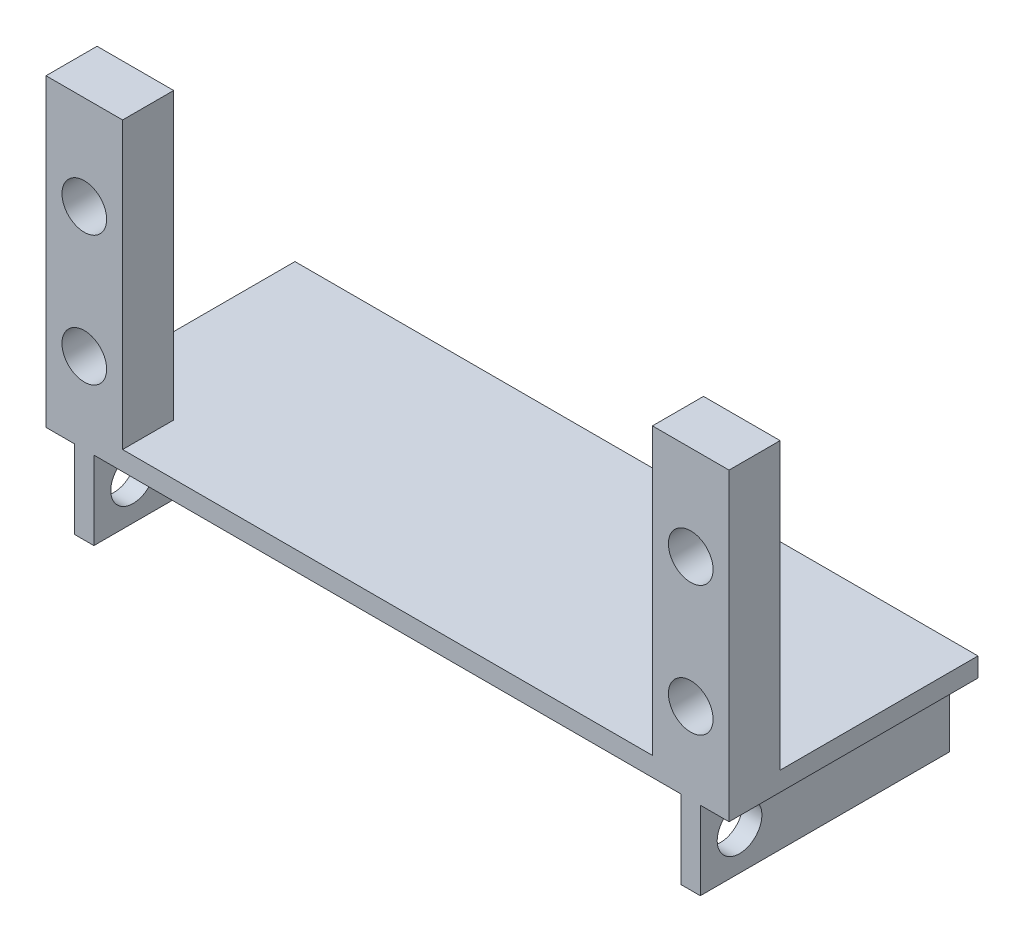
ISO-10303-21;
HEADER;
FILE_DESCRIPTION(('STEP AP214'),'2;1');
FILE_NAME('part.step','',(''),(''),'','','');
FILE_SCHEMA(('AUTOMOTIVE_DESIGN { 1 0 10303 214 1 1 1 1 }'));
ENDSEC;
DATA;
#1=APPLICATION_CONTEXT('core data for automotive mechanical design processes');
#2=APPLICATION_PROTOCOL_DEFINITION('international standard','automotive_design',2000,#1);
#3=PRODUCT_CONTEXT('',#1,'mechanical');
#4=PRODUCT('Part','Part','',(#3));
#5=PRODUCT_RELATED_PRODUCT_CATEGORY('part','',(#4));
#6=PRODUCT_DEFINITION_FORMATION('','',#4);
#7=PRODUCT_DEFINITION_CONTEXT('part definition',#1,'design');
#8=PRODUCT_DEFINITION('design','',#6,#7);
#9=PRODUCT_DEFINITION_SHAPE('','',#8);
#10=(LENGTH_UNIT() NAMED_UNIT(*) SI_UNIT(.MILLI.,.METRE.));
#11=(NAMED_UNIT(*) PLANE_ANGLE_UNIT() SI_UNIT($,.RADIAN.));
#12=(NAMED_UNIT(*) SI_UNIT($,.STERADIAN.) SOLID_ANGLE_UNIT());
#13=UNCERTAINTY_MEASURE_WITH_UNIT(LENGTH_MEASURE(1.E-05),#10,'distance_accuracy_value','');
#14=(GEOMETRIC_REPRESENTATION_CONTEXT(3) GLOBAL_UNCERTAINTY_ASSIGNED_CONTEXT((#13)) GLOBAL_UNIT_ASSIGNED_CONTEXT((#10,
#11,#12)) REPRESENTATION_CONTEXT('',''));
#15=CARTESIAN_POINT('',(0.,0.,0.));
#16=DIRECTION('',(0.,0.,1.));
#17=DIRECTION('',(1.,0.,0.));
#18=AXIS2_PLACEMENT_3D('',#15,#16,#17);
#19=CARTESIAN_POINT('',(0.,0.,0.));
#20=DIRECTION('',(0.,1.,0.));
#21=DIRECTION('',(0.,0.,1.));
#22=AXIS2_PLACEMENT_3D('',#19,#20,#21);
#23=PLANE('',#22);
#24=DIRECTION('',(-1.,0.,0.));
#25=VECTOR('',#24,1.);
#26=CARTESIAN_POINT('',(23.,0.,-8.25));
#27=LINE('',#26,#25);
#28=CARTESIAN_POINT('',(23.,0.,-8.25));
#29=VERTEX_POINT('',#28);
#30=CARTESIAN_POINT('',(-23.,0.,-8.25));
#31=VERTEX_POINT('',#30);
#32=EDGE_CURVE('E188',#29,#31,#27,.T.);
#33=ORIENTED_EDGE('',*,*,#32,.F.);
#34=DIRECTION('',(0.,0.,1.));
#35=VECTOR('',#34,1.);
#36=CARTESIAN_POINT('',(23.,0.,9.75));
#37=LINE('',#36,#35);
#38=CARTESIAN_POINT('',(23.,0.,9.75));
#39=VERTEX_POINT('',#38);
#40=EDGE_CURVE('E180',#29,#39,#37,.T.);
#41=ORIENTED_EDGE('',*,*,#40,.T.);
#42=DIRECTION('',(1.,0.,0.));
#43=VECTOR('',#42,1.);
#44=CARTESIAN_POINT('',(-26.75,0.,9.75));
#45=LINE('',#44,#43);
#46=CARTESIAN_POINT('',(-23.,0.,9.75));
#47=VERTEX_POINT('',#46);
#48=EDGE_CURVE('E346',#47,#39,#45,.T.);
#49=ORIENTED_EDGE('',*,*,#48,.F.);
#50=DIRECTION('',(0.,0.,1.));
#51=VECTOR('',#50,1.);
#52=CARTESIAN_POINT('',(-23.,0.,9.75));
#53=LINE('',#52,#51);
#54=EDGE_CURVE('E225',#31,#47,#53,.T.);
#55=ORIENTED_EDGE('',*,*,#54,.F.);
#56=EDGE_LOOP('',(#33,#41,#49,#55));
#57=FACE_BOUND('',#56,.T.);
#58=ADVANCED_FACE('F36',(#57),#23,.F.);
#59=CARTESIAN_POINT('',(-23.,-6.144,9.75));
#60=DIRECTION('',(-1.,0.,0.));
#61=DIRECTION('',(0.,0.,1.));
#62=AXIS2_PLACEMENT_3D('',#59,#60,#61);
#63=PLANE('',#62);
#64=CARTESIAN_POINT('',(-23.,-3.072,6.678));
#65=DIRECTION('',(-1.,0.,0.));
#66=DIRECTION('',(0.,0.,1.));
#67=AXIS2_PLACEMENT_3D('',#64,#65,#66);
#68=CIRCLE('',#67,1.75);
#69=CARTESIAN_POINT('',(-23.,-3.072,8.428));
#70=VERTEX_POINT('',#69);
#71=EDGE_CURVE('E706',#70,#70,#68,.T.);
#72=ORIENTED_EDGE('',*,*,#71,.T.);
#73=EDGE_LOOP('',(#72));
#74=FACE_BOUND('',#73,.T.);
#75=DIRECTION('',(0.,1.,0.));
#76=VECTOR('',#75,1.);
#77=CARTESIAN_POINT('',(-23.,-6.144,-8.25));
#78=LINE('',#77,#76);
#79=CARTESIAN_POINT('',(-23.,-6.144,-8.25));
#80=VERTEX_POINT('',#79);
#81=EDGE_CURVE('E53',#80,#31,#78,.T.);
#82=ORIENTED_EDGE('',*,*,#81,.T.);
#83=ORIENTED_EDGE('',*,*,#54,.T.);
#84=DIRECTION('',(0.,1.,0.));
#85=VECTOR('',#84,1.);
#86=CARTESIAN_POINT('',(-23.,-6.144,9.75));
#87=LINE('',#86,#85);
#88=CARTESIAN_POINT('',(-23.,-6.144,9.75));
#89=VERTEX_POINT('',#88);
#90=EDGE_CURVE('E242',#89,#47,#87,.T.);
#91=ORIENTED_EDGE('',*,*,#90,.F.);
#92=DIRECTION('',(0.,0.,1.));
#93=VECTOR('',#92,1.);
#94=CARTESIAN_POINT('',(-23.,-6.144,9.75));
#95=LINE('',#94,#93);
#96=EDGE_CURVE('E58',#80,#89,#95,.T.);
#97=ORIENTED_EDGE('',*,*,#96,.F.);
#98=EDGE_LOOP('',(#82,#83,#91,#97));
#99=FACE_BOUND('',#98,.T.);
#100=ADVANCED_FACE('F379',(#74,#99),#63,.F.);
#101=CARTESIAN_POINT('',(23.,-6.144,9.75));
#102=DIRECTION('',(-1.,0.,0.));
#103=DIRECTION('',(0.,0.,1.));
#104=AXIS2_PLACEMENT_3D('',#101,#102,#103);
#105=PLANE('',#104);
#106=CARTESIAN_POINT('',(23.,-3.072,6.67800000000001));
#107=DIRECTION('',(-1.,0.,0.));
#108=DIRECTION('',(0.,0.,1.));
#109=AXIS2_PLACEMENT_3D('',#106,#107,#108);
#110=CIRCLE('',#109,1.75);
#111=CARTESIAN_POINT('',(23.,-3.072,8.42800000000001));
#112=VERTEX_POINT('',#111);
#113=EDGE_CURVE('E704',#112,#112,#110,.T.);
#114=ORIENTED_EDGE('',*,*,#113,.F.);
#115=EDGE_LOOP('',(#114));
#116=FACE_BOUND('',#115,.T.);
#117=ORIENTED_EDGE('',*,*,#40,.F.);
#118=DIRECTION('',(0.,1.,0.));
#119=VECTOR('',#118,1.);
#120=CARTESIAN_POINT('',(23.,-6.144,-8.25));
#121=LINE('',#120,#119);
#122=CARTESIAN_POINT('',(23.,-6.144,-8.25));
#123=VERTEX_POINT('',#122);
#124=EDGE_CURVE('E178',#123,#29,#121,.T.);
#125=ORIENTED_EDGE('',*,*,#124,.F.);
#126=DIRECTION('',(0.,0.,1.));
#127=VECTOR('',#126,1.);
#128=CARTESIAN_POINT('',(23.,-6.144,9.75));
#129=LINE('',#128,#127);
#130=CARTESIAN_POINT('',(23.,-6.144,9.75));
#131=VERTEX_POINT('',#130);
#132=EDGE_CURVE('E161',#123,#131,#129,.T.);
#133=ORIENTED_EDGE('',*,*,#132,.T.);
#134=DIRECTION('',(0.,1.,0.));
#135=VECTOR('',#134,1.);
#136=CARTESIAN_POINT('',(23.,-6.144,9.75));
#137=LINE('',#136,#135);
#138=EDGE_CURVE('E213',#131,#39,#137,.T.);
#139=ORIENTED_EDGE('',*,*,#138,.T.);
#140=EDGE_LOOP('',(#117,#125,#133,#139));
#141=FACE_BOUND('',#140,.T.);
#142=ADVANCED_FACE('F179',(#116,#141),#105,.T.);
#143=CARTESIAN_POINT('',(24.5,0.,9.75));
#144=VERTEX_POINT('',#143);
#145=CARTESIAN_POINT('',(26.75,0.,9.75));
#146=VERTEX_POINT('',#145);
#147=EDGE_CURVE('E342',#144,#146,#45,.T.);
#148=ORIENTED_EDGE('',*,*,#147,.F.);
#149=DIRECTION('',(0.,0.,-1.));
#150=VECTOR('',#149,1.);
#151=CARTESIAN_POINT('',(24.5,0.,9.75));
#152=LINE('',#151,#150);
#153=CARTESIAN_POINT('',(24.5,0.,-9.75));
#154=VERTEX_POINT('',#153);
#155=EDGE_CURVE('E184',#144,#154,#152,.T.);
#156=ORIENTED_EDGE('',*,*,#155,.T.);
#157=DIRECTION('',(-1.,0.,0.));
#158=VECTOR('',#157,1.);
#159=CARTESIAN_POINT('',(-26.75,0.,-9.75));
#160=LINE('',#159,#158);
#161=CARTESIAN_POINT('',(26.75,0.,-9.75));
#162=VERTEX_POINT('',#161);
#163=EDGE_CURVE('E335',#162,#154,#160,.T.);
#164=ORIENTED_EDGE('',*,*,#163,.F.);
#165=DIRECTION('',(0.,0.,-1.));
#166=VECTOR('',#165,1.);
#167=CARTESIAN_POINT('',(26.75,0.,-9.75));
#168=LINE('',#167,#166);
#169=EDGE_CURVE('E316',#146,#162,#168,.T.);
#170=ORIENTED_EDGE('',*,*,#169,.F.);
#171=EDGE_LOOP('',(#148,#156,#164,#170));
#172=FACE_BOUND('',#171,.T.);
#173=ADVANCED_FACE('F391',(#172),#23,.F.);
#174=DIRECTION('',(0.,0.,-1.));
#175=VECTOR('',#174,1.);
#176=CARTESIAN_POINT('',(-24.5,0.,9.75));
#177=LINE('',#176,#175);
#178=CARTESIAN_POINT('',(-24.5,0.,9.75));
#179=VERTEX_POINT('',#178);
#180=CARTESIAN_POINT('',(-24.5,0.,-9.75));
#181=VERTEX_POINT('',#180);
#182=EDGE_CURVE('E220',#179,#181,#177,.T.);
#183=ORIENTED_EDGE('',*,*,#182,.F.);
#184=CARTESIAN_POINT('',(-26.75,0.,9.75));
#185=VERTEX_POINT('',#184);
#186=EDGE_CURVE('E321',#185,#179,#45,.T.);
#187=ORIENTED_EDGE('',*,*,#186,.F.);
#188=DIRECTION('',(0.,0.,1.));
#189=VECTOR('',#188,1.);
#190=CARTESIAN_POINT('',(-26.75,0.,-9.75));
#191=LINE('',#190,#189);
#192=CARTESIAN_POINT('',(-26.75,0.,-9.75));
#193=VERTEX_POINT('',#192);
#194=EDGE_CURVE('E339',#193,#185,#191,.T.);
#195=ORIENTED_EDGE('',*,*,#194,.F.);
#196=EDGE_CURVE('E334',#181,#193,#160,.T.);
#197=ORIENTED_EDGE('',*,*,#196,.F.);
#198=EDGE_LOOP('',(#183,#187,#195,#197));
#199=FACE_BOUND('',#198,.T.);
#200=ADVANCED_FACE('F366',(#199),#23,.F.);
#201=CARTESIAN_POINT('',(0.,1.5,0.));
#202=DIRECTION('',(0.,1.,0.));
#203=DIRECTION('',(0.,0.,1.));
#204=AXIS2_PLACEMENT_3D('',#201,#202,#203);
#205=PLANE('',#204);
#206=DIRECTION('',(0.,0.,1.));
#207=VECTOR('',#206,1.);
#208=CARTESIAN_POINT('',(20.75,1.5,9.74999999999999));
#209=LINE('',#208,#207);
#210=CARTESIAN_POINT('',(20.75,1.5,5.74999999999999));
#211=VERTEX_POINT('',#210);
#212=CARTESIAN_POINT('',(20.75,1.5,9.75));
#213=VERTEX_POINT('',#212);
#214=EDGE_CURVE('E256',#211,#213,#209,.T.);
#215=ORIENTED_EDGE('',*,*,#214,.F.);
#216=DIRECTION('',(-1.,0.,0.));
#217=VECTOR('',#216,1.);
#218=CARTESIAN_POINT('',(26.75,1.5,5.74999999999999));
#219=LINE('',#218,#217);
#220=CARTESIAN_POINT('',(26.75,1.5,5.74999999999999));
#221=VERTEX_POINT('',#220);
#222=EDGE_CURVE('E250',#221,#211,#219,.T.);
#223=ORIENTED_EDGE('',*,*,#222,.F.);
#224=DIRECTION('',(0.,0.,-1.));
#225=VECTOR('',#224,1.);
#226=CARTESIAN_POINT('',(26.75,1.5,-9.75));
#227=LINE('',#226,#225);
#228=CARTESIAN_POINT('',(26.75,1.5,-9.75));
#229=VERTEX_POINT('',#228);
#230=EDGE_CURVE('E317',#221,#229,#227,.T.);
#231=ORIENTED_EDGE('',*,*,#230,.T.);
#232=DIRECTION('',(-1.,0.,0.));
#233=VECTOR('',#232,1.);
#234=CARTESIAN_POINT('',(-26.75,1.5,-9.75));
#235=LINE('',#234,#233);
#236=CARTESIAN_POINT('',(-26.75,1.5,-9.75));
#237=VERTEX_POINT('',#236);
#238=EDGE_CURVE('E320',#229,#237,#235,.T.);
#239=ORIENTED_EDGE('',*,*,#238,.T.);
#240=DIRECTION('',(0.,0.,1.));
#241=VECTOR('',#240,1.);
#242=CARTESIAN_POINT('',(-26.75,1.5,-9.75));
#243=LINE('',#242,#241);
#244=CARTESIAN_POINT('',(-26.75,1.5,5.75));
#245=VERTEX_POINT('',#244);
#246=EDGE_CURVE('E324',#237,#245,#243,.T.);
#247=ORIENTED_EDGE('',*,*,#246,.T.);
#248=DIRECTION('',(-1.,0.,0.));
#249=VECTOR('',#248,1.);
#250=CARTESIAN_POINT('',(-26.75,1.5,5.75));
#251=LINE('',#250,#249);
#252=CARTESIAN_POINT('',(-20.75,1.5,5.75));
#253=VERTEX_POINT('',#252);
#254=EDGE_CURVE('E289',#253,#245,#251,.T.);
#255=ORIENTED_EDGE('',*,*,#254,.F.);
#256=DIRECTION('',(0.,0.,-1.));
#257=VECTOR('',#256,1.);
#258=CARTESIAN_POINT('',(-20.75,1.5,9.75));
#259=LINE('',#258,#257);
#260=CARTESIAN_POINT('',(-20.75,1.5,9.75));
#261=VERTEX_POINT('',#260);
#262=EDGE_CURVE('E283',#261,#253,#259,.T.);
#263=ORIENTED_EDGE('',*,*,#262,.F.);
#264=DIRECTION('',(1.,0.,0.));
#265=VECTOR('',#264,1.);
#266=CARTESIAN_POINT('',(-26.75,1.5,9.75));
#267=LINE('',#266,#265);
#268=EDGE_CURVE('E327',#261,#213,#267,.T.);
#269=ORIENTED_EDGE('',*,*,#268,.T.);
#270=EDGE_LOOP('',(#215,#223,#231,#239,#247,#255,#263,#269));
#271=FACE_BOUND('',#270,.T.);
#272=ADVANCED_FACE('F406',(#271),#205,.T.);
#273=CARTESIAN_POINT('',(26.75,1.5,-9.75));
#274=DIRECTION('',(-1.,0.,0.));
#275=DIRECTION('',(0.,0.,1.));
#276=AXIS2_PLACEMENT_3D('',#273,#274,#275);
#277=PLANE('',#276);
#278=ORIENTED_EDGE('',*,*,#169,.T.);
#279=DIRECTION('',(0.,-1.,0.));
#280=VECTOR('',#279,1.);
#281=CARTESIAN_POINT('',(26.75,1.5,-9.75));
#282=LINE('',#281,#280);
#283=EDGE_CURVE('E11',#229,#162,#282,.T.);
#284=ORIENTED_EDGE('',*,*,#283,.F.);
#285=ORIENTED_EDGE('',*,*,#230,.F.);
#286=DIRECTION('',(0.,-1.,0.));
#287=VECTOR('',#286,1.);
#288=CARTESIAN_POINT('',(26.75,23.856,5.74999999999999));
#289=LINE('',#288,#287);
#290=CARTESIAN_POINT('',(26.75,23.856,5.74999999999999));
#291=VERTEX_POINT('',#290);
#292=EDGE_CURVE('E279',#291,#221,#289,.T.);
#293=ORIENTED_EDGE('',*,*,#292,.F.);
#294=DIRECTION('',(0.,0.,-1.));
#295=VECTOR('',#294,1.);
#296=CARTESIAN_POINT('',(26.75,23.856,9.74999999999999));
#297=LINE('',#296,#295);
#298=CARTESIAN_POINT('',(26.75,23.856,9.74999999999999));
#299=VERTEX_POINT('',#298);
#300=EDGE_CURVE('E251',#299,#291,#297,.T.);
#301=ORIENTED_EDGE('',*,*,#300,.F.);
#302=DIRECTION('',(0.,-1.,0.));
#303=VECTOR('',#302,1.);
#304=CARTESIAN_POINT('',(26.75,1.5,9.75));
#305=LINE('',#304,#303);
#306=EDGE_CURVE('E330',#299,#146,#305,.T.);
#307=ORIENTED_EDGE('',*,*,#306,.T.);
#308=EDGE_LOOP('',(#278,#284,#285,#293,#301,#307));
#309=FACE_BOUND('',#308,.T.);
#310=ADVANCED_FACE('F38',(#309),#277,.F.);
#311=CARTESIAN_POINT('',(-26.75,1.5,-9.75));
#312=DIRECTION('',(0.,0.,1.));
#313=DIRECTION('',(1.,0.,0.));
#314=AXIS2_PLACEMENT_3D('',#311,#312,#313);
#315=PLANE('',#314);
#316=ORIENTED_EDGE('',*,*,#163,.T.);
#317=DIRECTION('',(0.,1.,0.));
#318=VECTOR('',#317,1.);
#319=CARTESIAN_POINT('',(24.5,-6.144,-9.75));
#320=LINE('',#319,#318);
#321=CARTESIAN_POINT('',(24.5,-6.144,-9.75));
#322=VERTEX_POINT('',#321);
#323=EDGE_CURVE('E174',#322,#154,#320,.T.);
#324=ORIENTED_EDGE('',*,*,#323,.F.);
#325=DIRECTION('',(1.,0.,0.));
#326=VECTOR('',#325,1.);
#327=CARTESIAN_POINT('',(-24.5,-6.144,-9.75));
#328=LINE('',#327,#326);
#329=CARTESIAN_POINT('',(-24.5,-6.144,-9.75));
#330=VERTEX_POINT('',#329);
#331=EDGE_CURVE('E224',#330,#322,#328,.T.);
#332=ORIENTED_EDGE('',*,*,#331,.F.);
#333=DIRECTION('',(0.,1.,0.));
#334=VECTOR('',#333,1.);
#335=CARTESIAN_POINT('',(-24.5,-6.144,-9.75));
#336=LINE('',#335,#334);
#337=EDGE_CURVE('E246',#330,#181,#336,.T.);
#338=ORIENTED_EDGE('',*,*,#337,.T.);
#339=ORIENTED_EDGE('',*,*,#196,.T.);
#340=DIRECTION('',(0.,-1.,0.));
#341=VECTOR('',#340,1.);
#342=CARTESIAN_POINT('',(-26.75,1.5,-9.75));
#343=LINE('',#342,#341);
#344=EDGE_CURVE('E46',#237,#193,#343,.T.);
#345=ORIENTED_EDGE('',*,*,#344,.F.);
#346=ORIENTED_EDGE('',*,*,#238,.F.);
#347=ORIENTED_EDGE('',*,*,#283,.T.);
#348=EDGE_LOOP('',(#316,#324,#332,#338,#339,#345,#346,#347));
#349=FACE_BOUND('',#348,.T.);
#350=ADVANCED_FACE('F392',(#349),#315,.F.);
#351=CARTESIAN_POINT('',(-26.75,1.5,-9.75));
#352=DIRECTION('',(1.,0.,0.));
#353=DIRECTION('',(0.,0.,-1.));
#354=AXIS2_PLACEMENT_3D('',#351,#352,#353);
#355=PLANE('',#354);
#356=ORIENTED_EDGE('',*,*,#194,.T.);
#357=DIRECTION('',(0.,-1.,0.));
#358=VECTOR('',#357,1.);
#359=CARTESIAN_POINT('',(-26.75,1.5,9.75));
#360=LINE('',#359,#358);
#361=CARTESIAN_POINT('',(-26.75,23.856,9.75));
#362=VERTEX_POINT('',#361);
#363=EDGE_CURVE('E350',#362,#185,#360,.T.);
#364=ORIENTED_EDGE('',*,*,#363,.F.);
#365=DIRECTION('',(0.,0.,1.));
#366=VECTOR('',#365,1.);
#367=CARTESIAN_POINT('',(-26.75,23.856,9.75));
#368=LINE('',#367,#366);
#369=CARTESIAN_POINT('',(-26.75,23.856,5.75));
#370=VERTEX_POINT('',#369);
#371=EDGE_CURVE('E284',#370,#362,#368,.T.);
#372=ORIENTED_EDGE('',*,*,#371,.F.);
#373=DIRECTION('',(0.,-1.,0.));
#374=VECTOR('',#373,1.);
#375=CARTESIAN_POINT('',(-26.75,23.856,5.75));
#376=LINE('',#375,#374);
#377=EDGE_CURVE('E298',#370,#245,#376,.T.);
#378=ORIENTED_EDGE('',*,*,#377,.T.);
#379=ORIENTED_EDGE('',*,*,#246,.F.);
#380=ORIENTED_EDGE('',*,*,#344,.T.);
#381=EDGE_LOOP('',(#356,#364,#372,#378,#379,#380));
#382=FACE_BOUND('',#381,.T.);
#383=ADVANCED_FACE('F361',(#382),#355,.F.);
#384=CARTESIAN_POINT('',(-26.75,1.5,9.75));
#385=DIRECTION('',(0.,0.,-1.));
#386=DIRECTION('',(-1.,0.,0.));
#387=AXIS2_PLACEMENT_3D('',#384,#385,#386);
#388=PLANE('',#387);
#389=CARTESIAN_POINT('',(23.75,6.326,9.75));
#390=DIRECTION('',(0.,0.,-1.));
#391=DIRECTION('',(-1.,0.,0.));
#392=AXIS2_PLACEMENT_3D('',#389,#390,#391);
#393=CIRCLE('',#392,1.75);
#394=CARTESIAN_POINT('',(22.,6.326,9.75));
#395=VERTEX_POINT('',#394);
#396=EDGE_CURVE('E718',#395,#395,#393,.T.);
#397=ORIENTED_EDGE('',*,*,#396,.T.);
#398=EDGE_LOOP('',(#397));
#399=FACE_BOUND('',#398,.T.);
#400=CARTESIAN_POINT('',(23.75,16.486,9.75));
#401=DIRECTION('',(0.,0.,-1.));
#402=DIRECTION('',(-1.,0.,0.));
#403=AXIS2_PLACEMENT_3D('',#400,#401,#402);
#404=CIRCLE('',#403,1.75);
#405=CARTESIAN_POINT('',(22.,16.486,9.75));
#406=VERTEX_POINT('',#405);
#407=EDGE_CURVE('E725',#406,#406,#404,.T.);
#408=ORIENTED_EDGE('',*,*,#407,.T.);
#409=EDGE_LOOP('',(#408));
#410=FACE_BOUND('',#409,.T.);
#411=CARTESIAN_POINT('',(-23.75,6.326,9.75));
#412=DIRECTION('',(0.,0.,1.));
#413=DIRECTION('',(1.,0.,0.));
#414=AXIS2_PLACEMENT_3D('',#411,#412,#413);
#415=CIRCLE('',#414,1.75);
#416=CARTESIAN_POINT('',(-22.,6.326,9.75));
#417=VERTEX_POINT('',#416);
#418=EDGE_CURVE('E732',#417,#417,#415,.T.);
#419=ORIENTED_EDGE('',*,*,#418,.F.);
#420=EDGE_LOOP('',(#419));
#421=FACE_BOUND('',#420,.T.);
#422=CARTESIAN_POINT('',(-23.75,16.486,9.75));
#423=DIRECTION('',(0.,0.,1.));
#424=DIRECTION('',(1.,0.,0.));
#425=AXIS2_PLACEMENT_3D('',#422,#423,#424);
#426=CIRCLE('',#425,1.75);
#427=CARTESIAN_POINT('',(-22.,16.486,9.75));
#428=VERTEX_POINT('',#427);
#429=EDGE_CURVE('E721',#428,#428,#426,.T.);
#430=ORIENTED_EDGE('',*,*,#429,.F.);
#431=EDGE_LOOP('',(#430));
#432=FACE_BOUND('',#431,.T.);
#433=ORIENTED_EDGE('',*,*,#186,.T.);
#434=DIRECTION('',(0.,1.,0.));
#435=VECTOR('',#434,1.);
#436=CARTESIAN_POINT('',(-24.5,-6.144,9.75));
#437=LINE('',#436,#435);
#438=CARTESIAN_POINT('',(-24.5,-6.144,9.75));
#439=VERTEX_POINT('',#438);
#440=EDGE_CURVE('E233',#439,#179,#437,.T.);
#441=ORIENTED_EDGE('',*,*,#440,.F.);
#442=DIRECTION('',(-1.,0.,0.));
#443=VECTOR('',#442,1.);
#444=CARTESIAN_POINT('',(-24.5,-6.144,9.75));
#445=LINE('',#444,#443);
#446=EDGE_CURVE('E230',#89,#439,#445,.T.);
#447=ORIENTED_EDGE('',*,*,#446,.F.);
#448=ORIENTED_EDGE('',*,*,#90,.T.);
#449=ORIENTED_EDGE('',*,*,#48,.T.);
#450=ORIENTED_EDGE('',*,*,#138,.F.);
#451=DIRECTION('',(1.,0.,0.));
#452=VECTOR('',#451,1.);
#453=CARTESIAN_POINT('',(24.5,-6.144,9.75));
#454=LINE('',#453,#452);
#455=CARTESIAN_POINT('',(24.5,-6.144,9.75));
#456=VERTEX_POINT('',#455);
#457=EDGE_CURVE('E169',#131,#456,#454,.T.);
#458=ORIENTED_EDGE('',*,*,#457,.T.);
#459=DIRECTION('',(0.,1.,0.));
#460=VECTOR('',#459,1.);
#461=CARTESIAN_POINT('',(24.5,-6.144,9.75));
#462=LINE('',#461,#460);
#463=EDGE_CURVE('E216',#456,#144,#462,.T.);
#464=ORIENTED_EDGE('',*,*,#463,.T.);
#465=ORIENTED_EDGE('',*,*,#147,.T.);
#466=ORIENTED_EDGE('',*,*,#306,.F.);
#467=DIRECTION('',(1.,0.,0.));
#468=VECTOR('',#467,1.);
#469=CARTESIAN_POINT('',(26.75,23.856,9.74999999999999));
#470=LINE('',#469,#468);
#471=CARTESIAN_POINT('',(20.75,23.856,9.74999999999999));
#472=VERTEX_POINT('',#471);
#473=EDGE_CURVE('E262',#472,#299,#470,.T.);
#474=ORIENTED_EDGE('',*,*,#473,.F.);
#475=DIRECTION('',(0.,-1.,0.));
#476=VECTOR('',#475,1.);
#477=CARTESIAN_POINT('',(20.75,23.856,9.74999999999999));
#478=LINE('',#477,#476);
#479=EDGE_CURVE('E266',#472,#213,#478,.T.);
#480=ORIENTED_EDGE('',*,*,#479,.T.);
#481=ORIENTED_EDGE('',*,*,#268,.F.);
#482=DIRECTION('',(0.,-1.,0.));
#483=VECTOR('',#482,1.);
#484=CARTESIAN_POINT('',(-20.75,23.856,9.75));
#485=LINE('',#484,#483);
#486=CARTESIAN_POINT('',(-20.75,23.856,9.75));
#487=VERTEX_POINT('',#486);
#488=EDGE_CURVE('E312',#487,#261,#485,.T.);
#489=ORIENTED_EDGE('',*,*,#488,.F.);
#490=DIRECTION('',(1.,0.,0.));
#491=VECTOR('',#490,1.);
#492=CARTESIAN_POINT('',(-26.75,23.856,9.75));
#493=LINE('',#492,#491);
#494=EDGE_CURVE('E288',#362,#487,#493,.T.);
#495=ORIENTED_EDGE('',*,*,#494,.F.);
#496=ORIENTED_EDGE('',*,*,#363,.T.);
#497=EDGE_LOOP('',(#433,#441,#447,#448,#449,#450,#458,#464,#465,#466,#474,#480,#481,#489,#495,#496));
#498=FACE_BOUND('',#497,.T.);
#499=ADVANCED_FACE('F369',(#399,#410,#421,#432,#498),#388,.F.);
#500=CARTESIAN_POINT('',(-20.75,23.856,9.75));
#501=DIRECTION('',(-1.,0.,0.));
#502=DIRECTION('',(0.,0.,1.));
#503=AXIS2_PLACEMENT_3D('',#500,#501,#502);
#504=PLANE('',#503);
#505=ORIENTED_EDGE('',*,*,#262,.T.);
#506=DIRECTION('',(0.,-1.,0.));
#507=VECTOR('',#506,1.);
#508=CARTESIAN_POINT('',(-20.75,23.856,5.75));
#509=LINE('',#508,#507);
#510=CARTESIAN_POINT('',(-20.75,23.856,5.75));
#511=VERTEX_POINT('',#510);
#512=EDGE_CURVE('E308',#511,#253,#509,.T.);
#513=ORIENTED_EDGE('',*,*,#512,.F.);
#514=DIRECTION('',(0.,0.,-1.));
#515=VECTOR('',#514,1.);
#516=CARTESIAN_POINT('',(-20.75,23.856,9.75));
#517=LINE('',#516,#515);
#518=EDGE_CURVE('E292',#487,#511,#517,.T.);
#519=ORIENTED_EDGE('',*,*,#518,.F.);
#520=ORIENTED_EDGE('',*,*,#488,.T.);
#521=EDGE_LOOP('',(#505,#513,#519,#520));
#522=FACE_BOUND('',#521,.T.);
#523=ADVANCED_FACE('F409',(#522),#504,.F.);
#524=CARTESIAN_POINT('',(-26.75,23.856,5.75));
#525=DIRECTION('',(0.,0.,1.));
#526=DIRECTION('',(1.,0.,0.));
#527=AXIS2_PLACEMENT_3D('',#524,#525,#526);
#528=PLANE('',#527);
#529=CARTESIAN_POINT('',(-23.75,6.326,5.75));
#530=DIRECTION('',(0.,0.,1.));
#531=DIRECTION('',(1.,0.,0.));
#532=AXIS2_PLACEMENT_3D('',#529,#530,#531);
#533=CIRCLE('',#532,1.75);
#534=CARTESIAN_POINT('',(-22.,6.326,5.75));
#535=VERTEX_POINT('',#534);
#536=EDGE_CURVE('E194',#535,#535,#533,.F.);
#537=ORIENTED_EDGE('',*,*,#536,.F.);
#538=EDGE_LOOP('',(#537));
#539=FACE_BOUND('',#538,.T.);
#540=CARTESIAN_POINT('',(-23.75,16.486,5.75));
#541=DIRECTION('',(0.,0.,1.));
#542=DIRECTION('',(1.,0.,0.));
#543=AXIS2_PLACEMENT_3D('',#540,#541,#542);
#544=CIRCLE('',#543,1.75);
#545=CARTESIAN_POINT('',(-22.,16.486,5.75));
#546=VERTEX_POINT('',#545);
#547=EDGE_CURVE('E197',#546,#546,#544,.F.);
#548=ORIENTED_EDGE('',*,*,#547,.F.);
#549=EDGE_LOOP('',(#548));
#550=FACE_BOUND('',#549,.T.);
#551=ORIENTED_EDGE('',*,*,#254,.T.);
#552=ORIENTED_EDGE('',*,*,#377,.F.);
#553=DIRECTION('',(-1.,0.,0.));
#554=VECTOR('',#553,1.);
#555=CARTESIAN_POINT('',(-26.75,23.856,5.75));
#556=LINE('',#555,#554);
#557=EDGE_CURVE('E295',#511,#370,#556,.T.);
#558=ORIENTED_EDGE('',*,*,#557,.F.);
#559=ORIENTED_EDGE('',*,*,#512,.T.);
#560=EDGE_LOOP('',(#551,#552,#558,#559));
#561=FACE_BOUND('',#560,.T.);
#562=ADVANCED_FACE('F413',(#539,#550,#561),#528,.F.);
#563=CARTESIAN_POINT('',(0.,23.856,0.));
#564=DIRECTION('',(0.,-1.,0.));
#565=DIRECTION('',(0.,0.,-1.));
#566=AXIS2_PLACEMENT_3D('',#563,#564,#565);
#567=PLANE('',#566);
#568=ORIENTED_EDGE('',*,*,#371,.T.);
#569=ORIENTED_EDGE('',*,*,#494,.T.);
#570=ORIENTED_EDGE('',*,*,#518,.T.);
#571=ORIENTED_EDGE('',*,*,#557,.T.);
#572=EDGE_LOOP('',(#568,#569,#570,#571));
#573=FACE_BOUND('',#572,.T.);
#574=ADVANCED_FACE('F417',(#573),#567,.F.);
#575=CARTESIAN_POINT('',(26.75,23.856,5.74999999999999));
#576=DIRECTION('',(0.,0.,1.));
#577=DIRECTION('',(1.,0.,0.));
#578=AXIS2_PLACEMENT_3D('',#575,#576,#577);
#579=PLANE('',#578);
#580=CARTESIAN_POINT('',(23.75,6.326,5.74999999999999));
#581=DIRECTION('',(0.,0.,1.));
#582=DIRECTION('',(1.,0.,0.));
#583=AXIS2_PLACEMENT_3D('',#580,#581,#582);
#584=CIRCLE('',#583,1.75);
#585=CARTESIAN_POINT('',(25.5,6.326,5.74999999999999));
#586=VERTEX_POINT('',#585);
#587=EDGE_CURVE('E722',#586,#586,#584,.T.);
#588=ORIENTED_EDGE('',*,*,#587,.T.);
#589=EDGE_LOOP('',(#588));
#590=FACE_BOUND('',#589,.T.);
#591=CARTESIAN_POINT('',(23.75,16.486,5.74999999999999));
#592=DIRECTION('',(0.,0.,1.));
#593=DIRECTION('',(1.,0.,0.));
#594=AXIS2_PLACEMENT_3D('',#591,#592,#593);
#595=CIRCLE('',#594,1.75);
#596=CARTESIAN_POINT('',(25.5,16.486,5.74999999999999));
#597=VERTEX_POINT('',#596);
#598=EDGE_CURVE('E711',#597,#597,#595,.T.);
#599=ORIENTED_EDGE('',*,*,#598,.T.);
#600=EDGE_LOOP('',(#599));
#601=FACE_BOUND('',#600,.T.);
#602=ORIENTED_EDGE('',*,*,#222,.T.);
#603=DIRECTION('',(0.,-1.,0.));
#604=VECTOR('',#603,1.);
#605=CARTESIAN_POINT('',(20.75,23.856,5.74999999999999));
#606=LINE('',#605,#604);
#607=CARTESIAN_POINT('',(20.75,23.856,5.74999999999999));
#608=VERTEX_POINT('',#607);
#609=EDGE_CURVE('E275',#608,#211,#606,.T.);
#610=ORIENTED_EDGE('',*,*,#609,.F.);
#611=DIRECTION('',(-1.,0.,0.));
#612=VECTOR('',#611,1.);
#613=CARTESIAN_POINT('',(26.75,23.856,5.74999999999999));
#614=LINE('',#613,#612);
#615=EDGE_CURVE('E255',#291,#608,#614,.T.);
#616=ORIENTED_EDGE('',*,*,#615,.F.);
#617=ORIENTED_EDGE('',*,*,#292,.T.);
#618=EDGE_LOOP('',(#602,#610,#616,#617));
#619=FACE_BOUND('',#618,.T.);
#620=ADVANCED_FACE('F396',(#590,#601,#619),#579,.F.);
#621=CARTESIAN_POINT('',(20.75,23.856,9.74999999999999));
#622=DIRECTION('',(1.,0.,0.));
#623=DIRECTION('',(0.,0.,-1.));
#624=AXIS2_PLACEMENT_3D('',#621,#622,#623);
#625=PLANE('',#624);
#626=ORIENTED_EDGE('',*,*,#214,.T.);
#627=ORIENTED_EDGE('',*,*,#479,.F.);
#628=DIRECTION('',(0.,0.,1.));
#629=VECTOR('',#628,1.);
#630=CARTESIAN_POINT('',(20.75,23.856,9.74999999999999));
#631=LINE('',#630,#629);
#632=EDGE_CURVE('E259',#608,#472,#631,.T.);
#633=ORIENTED_EDGE('',*,*,#632,.F.);
#634=ORIENTED_EDGE('',*,*,#609,.T.);
#635=EDGE_LOOP('',(#626,#627,#633,#634));
#636=FACE_BOUND('',#635,.T.);
#637=ADVANCED_FACE('F405',(#636),#625,.F.);
#638=CARTESIAN_POINT('',(0.,23.856,0.));
#639=DIRECTION('',(0.,1.,0.));
#640=DIRECTION('',(0.,0.,1.));
#641=AXIS2_PLACEMENT_3D('',#638,#639,#640);
#642=PLANE('',#641);
#643=ORIENTED_EDGE('',*,*,#300,.T.);
#644=ORIENTED_EDGE('',*,*,#615,.T.);
#645=ORIENTED_EDGE('',*,*,#632,.T.);
#646=ORIENTED_EDGE('',*,*,#473,.T.);
#647=EDGE_LOOP('',(#643,#644,#645,#646));
#648=FACE_BOUND('',#647,.T.);
#649=ADVANCED_FACE('F400',(#648),#642,.T.);
#650=CARTESIAN_POINT('',(-24.5,-6.144,9.75));
#651=DIRECTION('',(1.,0.,0.));
#652=DIRECTION('',(0.,0.,-1.));
#653=AXIS2_PLACEMENT_3D('',#650,#651,#652);
#654=PLANE('',#653);
#655=CARTESIAN_POINT('',(-24.5,-3.072,6.678));
#656=DIRECTION('',(-1.,0.,0.));
#657=DIRECTION('',(0.,0.,1.));
#658=AXIS2_PLACEMENT_3D('',#655,#656,#657);
#659=CIRCLE('',#658,1.75);
#660=CARTESIAN_POINT('',(-24.5,-3.072,8.428));
#661=VERTEX_POINT('',#660);
#662=EDGE_CURVE('E715',#661,#661,#659,.T.);
#663=ORIENTED_EDGE('',*,*,#662,.F.);
#664=EDGE_LOOP('',(#663));
#665=FACE_BOUND('',#664,.T.);
#666=ORIENTED_EDGE('',*,*,#182,.T.);
#667=ORIENTED_EDGE('',*,*,#337,.F.);
#668=DIRECTION('',(0.,0.,-1.));
#669=VECTOR('',#668,1.);
#670=CARTESIAN_POINT('',(-24.5,-6.144,9.75));
#671=LINE('',#670,#669);
#672=EDGE_CURVE('E221',#439,#330,#671,.T.);
#673=ORIENTED_EDGE('',*,*,#672,.F.);
#674=ORIENTED_EDGE('',*,*,#440,.T.);
#675=EDGE_LOOP('',(#666,#667,#673,#674));
#676=FACE_BOUND('',#675,.T.);
#677=ADVANCED_FACE('F374',(#665,#676),#654,.F.);
#678=CARTESIAN_POINT('',(0.,-6.144,0.));
#679=DIRECTION('',(0.,-1.,0.));
#680=DIRECTION('',(0.,0.,-1.));
#681=AXIS2_PLACEMENT_3D('',#678,#679,#680);
#682=PLANE('',#681);
#683=ORIENTED_EDGE('',*,*,#672,.T.);
#684=ORIENTED_EDGE('',*,*,#331,.T.);
#685=DIRECTION('',(0.,0.,-1.));
#686=VECTOR('',#685,1.);
#687=CARTESIAN_POINT('',(24.5,-6.144,9.75));
#688=LINE('',#687,#686);
#689=EDGE_CURVE('E200',#456,#322,#688,.T.);
#690=ORIENTED_EDGE('',*,*,#689,.F.);
#691=ORIENTED_EDGE('',*,*,#457,.F.);
#692=ORIENTED_EDGE('',*,*,#132,.F.);
#693=DIRECTION('',(-1.,0.,0.));
#694=VECTOR('',#693,1.);
#695=CARTESIAN_POINT('',(23.,-6.144,-8.25));
#696=LINE('',#695,#694);
#697=EDGE_CURVE('E166',#123,#80,#696,.T.);
#698=ORIENTED_EDGE('',*,*,#697,.T.);
#699=ORIENTED_EDGE('',*,*,#96,.T.);
#700=ORIENTED_EDGE('',*,*,#446,.T.);
#701=EDGE_LOOP('',(#683,#684,#690,#691,#692,#698,#699,#700));
#702=FACE_BOUND('',#701,.T.);
#703=ADVANCED_FACE('F164',(#702),#682,.T.);
#704=CARTESIAN_POINT('',(24.5,-6.144,9.75));
#705=DIRECTION('',(1.,0.,0.));
#706=DIRECTION('',(0.,0.,-1.));
#707=AXIS2_PLACEMENT_3D('',#704,#705,#706);
#708=PLANE('',#707);
#709=CARTESIAN_POINT('',(24.5,-3.072,6.67800000000001));
#710=DIRECTION('',(1.,0.,0.));
#711=DIRECTION('',(0.,0.,-1.));
#712=AXIS2_PLACEMENT_3D('',#709,#710,#711);
#713=CIRCLE('',#712,1.75);
#714=CARTESIAN_POINT('',(24.5,-3.072,4.92800000000001));
#715=VERTEX_POINT('',#714);
#716=EDGE_CURVE('E40',#715,#715,#713,.T.);
#717=ORIENTED_EDGE('',*,*,#716,.F.);
#718=EDGE_LOOP('',(#717));
#719=FACE_BOUND('',#718,.T.);
#720=ORIENTED_EDGE('',*,*,#155,.F.);
#721=ORIENTED_EDGE('',*,*,#463,.F.);
#722=ORIENTED_EDGE('',*,*,#689,.T.);
#723=ORIENTED_EDGE('',*,*,#323,.T.);
#724=EDGE_LOOP('',(#720,#721,#722,#723));
#725=FACE_BOUND('',#724,.T.);
#726=ADVANCED_FACE('F521',(#719,#725),#708,.T.);
#727=CARTESIAN_POINT('',(23.,-6.144,-8.25));
#728=DIRECTION('',(0.,0.,-1.));
#729=DIRECTION('',(-1.,0.,0.));
#730=AXIS2_PLACEMENT_3D('',#727,#728,#729);
#731=PLANE('',#730);
#732=ORIENTED_EDGE('',*,*,#32,.T.);
#733=ORIENTED_EDGE('',*,*,#81,.F.);
#734=ORIENTED_EDGE('',*,*,#697,.F.);
#735=ORIENTED_EDGE('',*,*,#124,.T.);
#736=EDGE_LOOP('',(#732,#733,#734,#735));
#737=FACE_BOUND('',#736,.T.);
#738=ADVANCED_FACE('F186',(#737),#731,.F.);
#739=CARTESIAN_POINT('',(-23.75,16.486,-9.751));
#740=DIRECTION('',(0.,0.,1.));
#741=DIRECTION('',(1.,0.,0.));
#742=AXIS2_PLACEMENT_3D('',#739,#740,#741);
#743=CYLINDRICAL_SURFACE('',#742,1.75);
#744=ORIENTED_EDGE('',*,*,#429,.T.);
#745=EDGE_LOOP('',(#744));
#746=FACE_BOUND('',#745,.T.);
#747=ORIENTED_EDGE('',*,*,#547,.T.);
#748=EDGE_LOOP('',(#747));
#749=FACE_BOUND('',#748,.T.);
#750=ADVANCED_FACE('F536',(#746,#749),#743,.F.);
#751=CARTESIAN_POINT('',(-23.75,6.326,-9.751));
#752=DIRECTION('',(0.,0.,1.));
#753=DIRECTION('',(1.,0.,0.));
#754=AXIS2_PLACEMENT_3D('',#751,#752,#753);
#755=CYLINDRICAL_SURFACE('',#754,1.75);
#756=ORIENTED_EDGE('',*,*,#418,.T.);
#757=EDGE_LOOP('',(#756));
#758=FACE_BOUND('',#757,.T.);
#759=ORIENTED_EDGE('',*,*,#536,.T.);
#760=EDGE_LOOP('',(#759));
#761=FACE_BOUND('',#760,.T.);
#762=ADVANCED_FACE('F543',(#758,#761),#755,.F.);
#763=CARTESIAN_POINT('',(23.75,16.486,-9.751));
#764=DIRECTION('',(0.,0.,1.));
#765=DIRECTION('',(1.,0.,0.));
#766=AXIS2_PLACEMENT_3D('',#763,#764,#765);
#767=CYLINDRICAL_SURFACE('',#766,1.75);
#768=ORIENTED_EDGE('',*,*,#407,.F.);
#769=EDGE_LOOP('',(#768));
#770=FACE_BOUND('',#769,.T.);
#771=ORIENTED_EDGE('',*,*,#598,.F.);
#772=EDGE_LOOP('',(#771));
#773=FACE_BOUND('',#772,.T.);
#774=ADVANCED_FACE('F551',(#770,#773),#767,.F.);
#775=CARTESIAN_POINT('',(23.75,6.326,-9.751));
#776=DIRECTION('',(0.,0.,1.));
#777=DIRECTION('',(1.,0.,0.));
#778=AXIS2_PLACEMENT_3D('',#775,#776,#777);
#779=CYLINDRICAL_SURFACE('',#778,1.75);
#780=ORIENTED_EDGE('',*,*,#396,.F.);
#781=EDGE_LOOP('',(#780));
#782=FACE_BOUND('',#781,.T.);
#783=ORIENTED_EDGE('',*,*,#587,.F.);
#784=EDGE_LOOP('',(#783));
#785=FACE_BOUND('',#784,.T.);
#786=ADVANCED_FACE('F559',(#782,#785),#779,.F.);
#787=CARTESIAN_POINT('',(26.75,-3.072,6.67800000000001));
#788=DIRECTION('',(-1.,0.,0.));
#789=DIRECTION('',(0.,0.,1.));
#790=AXIS2_PLACEMENT_3D('',#787,#788,#789);
#791=CYLINDRICAL_SURFACE('',#790,1.75);
#792=ORIENTED_EDGE('',*,*,#113,.T.);
#793=EDGE_LOOP('',(#792));
#794=FACE_BOUND('',#793,.T.);
#795=ORIENTED_EDGE('',*,*,#716,.T.);
#796=EDGE_LOOP('',(#795));
#797=FACE_BOUND('',#796,.T.);
#798=ADVANCED_FACE('F568',(#794,#797),#791,.F.);
#799=ORIENTED_EDGE('',*,*,#662,.T.);
#800=EDGE_LOOP('',(#799));
#801=FACE_BOUND('',#800,.T.);
#802=ORIENTED_EDGE('',*,*,#71,.F.);
#803=EDGE_LOOP('',(#802));
#804=FACE_BOUND('',#803,.T.);
#805=ADVANCED_FACE('F577',(#801,#804),#791,.F.);
#806=CLOSED_SHELL('',(#58,#100,#142,#173,#200,#272,#310,#350,#383,#499,#523,#562,#574,#620,#637,
#649,#677,#703,#726,#738,#750,#762,#774,#786,#798,#805));
#807=MANIFOLD_SOLID_BREP('B2',#806);
#808=ADVANCED_BREP_SHAPE_REPRESENTATION('',(#18,#807),#14);
#809=SHAPE_DEFINITION_REPRESENTATION(#9,#808);
ENDSEC;
END-ISO-10303-21;
